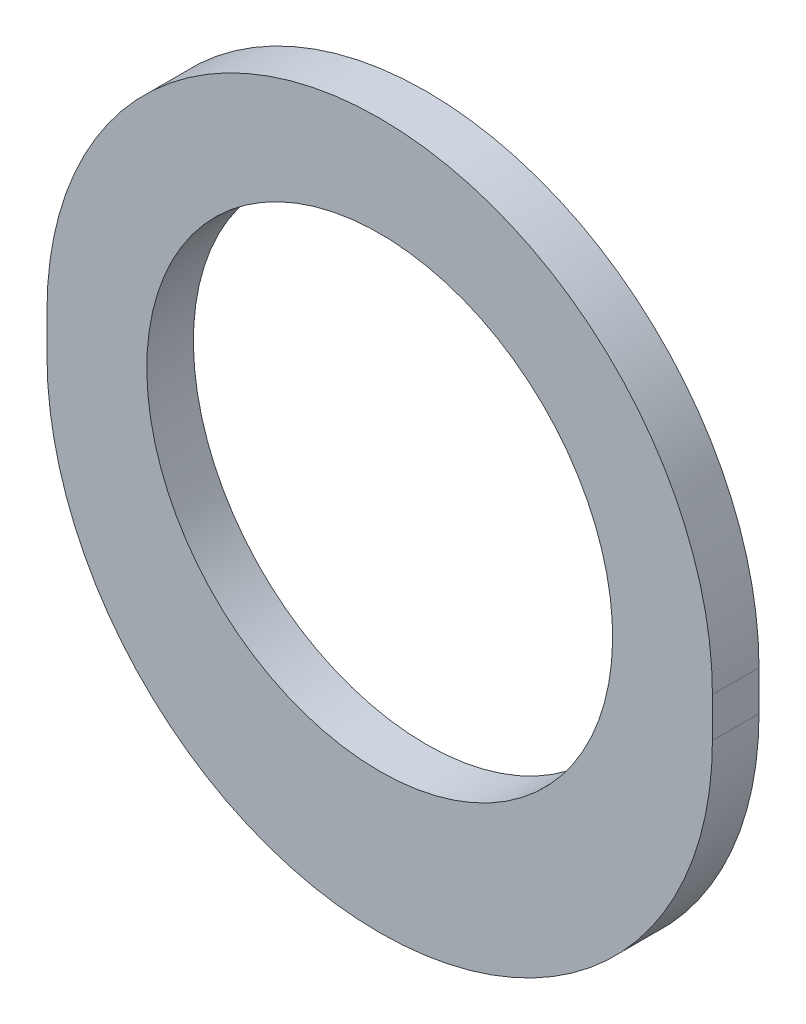
ISO-10303-21;
HEADER;
FILE_DESCRIPTION(('STEP AP214'),'2;1');
FILE_NAME('part.step','',(''),(''),'','','');
FILE_SCHEMA(('AUTOMOTIVE_DESIGN { 1 0 10303 214 1 1 1 1 }'));
ENDSEC;
DATA;
#1=APPLICATION_CONTEXT('core data for automotive mechanical design processes');
#2=APPLICATION_PROTOCOL_DEFINITION('international standard','automotive_design',2000,#1);
#3=PRODUCT_CONTEXT('',#1,'mechanical');
#4=PRODUCT('Part','Part','',(#3));
#5=PRODUCT_RELATED_PRODUCT_CATEGORY('part','',(#4));
#6=PRODUCT_DEFINITION_FORMATION('','',#4);
#7=PRODUCT_DEFINITION_CONTEXT('part definition',#1,'design');
#8=PRODUCT_DEFINITION('design','',#6,#7);
#9=PRODUCT_DEFINITION_SHAPE('','',#8);
#10=(LENGTH_UNIT() NAMED_UNIT(*) SI_UNIT(.MILLI.,.METRE.));
#11=(NAMED_UNIT(*) PLANE_ANGLE_UNIT() SI_UNIT($,.RADIAN.));
#12=(NAMED_UNIT(*) SI_UNIT($,.STERADIAN.) SOLID_ANGLE_UNIT());
#13=UNCERTAINTY_MEASURE_WITH_UNIT(LENGTH_MEASURE(1.E-05),#10,'distance_accuracy_value','');
#14=(GEOMETRIC_REPRESENTATION_CONTEXT(3) GLOBAL_UNCERTAINTY_ASSIGNED_CONTEXT((#13)) GLOBAL_UNIT_ASSIGNED_CONTEXT((#10,
#11,#12)) REPRESENTATION_CONTEXT('',''));
#15=CARTESIAN_POINT('',(0.,0.,0.));
#16=DIRECTION('',(0.,0.,1.));
#17=DIRECTION('',(1.,0.,0.));
#18=AXIS2_PLACEMENT_3D('',#15,#16,#17);
#19=CARTESIAN_POINT('',(133.95,-71.31,-0.045));
#20=DIRECTION('',(0.,0.,-1.));
#21=DIRECTION('',(0.,-1.,0.));
#22=AXIS2_PLACEMENT_3D('',#19,#20,#21);
#23=CYLINDRICAL_SURFACE('',#22,0.175);
#24=CARTESIAN_POINT('',(133.95,-71.31,-0.035));
#25=DIRECTION('',(0.,0.,-1.));
#26=DIRECTION('',(0.,-1.,0.));
#27=AXIS2_PLACEMENT_3D('',#24,#25,#26);
#28=CIRCLE('',#27,0.175);
#29=CARTESIAN_POINT('',(133.95,-71.485,-0.035));
#30=VERTEX_POINT('',#29);
#31=EDGE_CURVE('E84',#30,#30,#28,.T.);
#32=ORIENTED_EDGE('',*,*,#31,.T.);
#33=DIRECTION('',(0.,0.,1.));
#34=VECTOR('',#33,1.);
#35=CARTESIAN_POINT('',(133.95,-71.485,-0.045));
#36=LINE('',#35,#34);
#37=CARTESIAN_POINT('',(133.95,-71.485,0.));
#38=VERTEX_POINT('',#37);
#39=EDGE_CURVE('E11',#30,#38,#36,.T.);
#40=ORIENTED_EDGE('',*,*,#39,.T.);
#41=CARTESIAN_POINT('',(133.95,-71.31,0.));
#42=DIRECTION('',(0.,0.,-1.));
#43=DIRECTION('',(0.,-1.,0.));
#44=AXIS2_PLACEMENT_3D('',#41,#42,#43);
#45=CIRCLE('',#44,0.175);
#46=EDGE_CURVE('E25',#38,#38,#45,.T.);
#47=ORIENTED_EDGE('',*,*,#46,.F.);
#48=ORIENTED_EDGE('',*,*,#39,.F.);
#49=EDGE_LOOP('',(#32,#40,#47,#48));
#50=FACE_BOUND('',#49,.T.);
#51=ADVANCED_FACE('F17',(#50),#23,.F.);
#52=CARTESIAN_POINT('',(134.2,-71.34,-0.035));
#53=DIRECTION('',(-1.,0.,0.));
#54=DIRECTION('',(0.,0.,1.));
#55=AXIS2_PLACEMENT_3D('',#52,#53,#54);
#56=PLANE('',#55);
#57=DIRECTION('',(0.,1.,0.));
#58=VECTOR('',#57,1.);
#59=CARTESIAN_POINT('',(134.2,-71.34,-0.035));
#60=LINE('',#59,#58);
#61=CARTESIAN_POINT('',(134.2,-71.34,-0.035));
#62=VERTEX_POINT('',#61);
#63=CARTESIAN_POINT('',(134.2,-71.31,-0.035));
#64=VERTEX_POINT('',#63);
#65=EDGE_CURVE('E73',#62,#64,#60,.T.);
#66=ORIENTED_EDGE('',*,*,#65,.T.);
#67=DIRECTION('',(0.,0.,1.));
#68=VECTOR('',#67,1.);
#69=CARTESIAN_POINT('',(134.2,-71.31,-0.035));
#70=LINE('',#69,#68);
#71=CARTESIAN_POINT('',(134.2,-71.31,0.));
#72=VERTEX_POINT('',#71);
#73=EDGE_CURVE('E76',#64,#72,#70,.T.);
#74=ORIENTED_EDGE('',*,*,#73,.T.);
#75=DIRECTION('',(0.,1.,0.));
#76=VECTOR('',#75,1.);
#77=CARTESIAN_POINT('',(134.2,-71.34,0.));
#78=LINE('',#77,#76);
#79=CARTESIAN_POINT('',(134.2,-71.34,0.));
#80=VERTEX_POINT('',#79);
#81=EDGE_CURVE('E119',#80,#72,#78,.T.);
#82=ORIENTED_EDGE('',*,*,#81,.F.);
#83=DIRECTION('',(0.,0.,1.));
#84=VECTOR('',#83,1.);
#85=CARTESIAN_POINT('',(134.2,-71.34,-0.035));
#86=LINE('',#85,#84);
#87=EDGE_CURVE('E79',#62,#80,#86,.T.);
#88=ORIENTED_EDGE('',*,*,#87,.F.);
#89=EDGE_LOOP('',(#66,#74,#82,#88));
#90=FACE_BOUND('',#89,.T.);
#91=ADVANCED_FACE('F75',(#90),#56,.F.);
#92=CARTESIAN_POINT('',(133.7,-71.31,0.));
#93=DIRECTION('',(0.,0.,1.));
#94=DIRECTION('',(1.,0.,0.));
#95=AXIS2_PLACEMENT_3D('',#92,#93,#94);
#96=PLANE('',#95);
#97=ORIENTED_EDGE('',*,*,#46,.T.);
#98=EDGE_LOOP('',(#97));
#99=FACE_BOUND('',#98,.T.);
#100=DIRECTION('',(0.,-1.,0.));
#101=VECTOR('',#100,1.);
#102=CARTESIAN_POINT('',(133.7,-71.31,0.));
#103=LINE('',#102,#101);
#104=CARTESIAN_POINT('',(133.7,-71.31,0.));
#105=VERTEX_POINT('',#104);
#106=CARTESIAN_POINT('',(133.7,-71.34,0.));
#107=VERTEX_POINT('',#106);
#108=EDGE_CURVE('E110',#105,#107,#103,.T.);
#109=ORIENTED_EDGE('',*,*,#108,.T.);
#110=CARTESIAN_POINT('',(133.95,-71.34,0.));
#111=DIRECTION('',(0.,0.,1.));
#112=DIRECTION('',(-1.,0.,0.));
#113=AXIS2_PLACEMENT_3D('',#110,#111,#112);
#114=CIRCLE('',#113,0.25);
#115=EDGE_CURVE('E85',#107,#80,#114,.T.);
#116=ORIENTED_EDGE('',*,*,#115,.T.);
#117=ORIENTED_EDGE('',*,*,#81,.T.);
#118=CARTESIAN_POINT('',(133.95,-71.31,0.));
#119=DIRECTION('',(0.,0.,1.));
#120=DIRECTION('',(1.,0.,0.));
#121=AXIS2_PLACEMENT_3D('',#118,#119,#120);
#122=CIRCLE('',#121,0.25);
#123=EDGE_CURVE('E93',#72,#105,#122,.T.);
#124=ORIENTED_EDGE('',*,*,#123,.T.);
#125=EDGE_LOOP('',(#109,#116,#117,#124));
#126=FACE_BOUND('',#125,.T.);
#127=ADVANCED_FACE('F125',(#99,#126),#96,.T.);
#128=CARTESIAN_POINT('',(133.7,-71.31,-0.035));
#129=DIRECTION('',(0.,0.,1.));
#130=DIRECTION('',(1.,0.,0.));
#131=AXIS2_PLACEMENT_3D('',#128,#129,#130);
#132=PLANE('',#131);
#133=ORIENTED_EDGE('',*,*,#31,.F.);
#134=EDGE_LOOP('',(#133));
#135=FACE_BOUND('',#134,.T.);
#136=CARTESIAN_POINT('',(133.95,-71.31,-0.035));
#137=DIRECTION('',(0.,0.,1.));
#138=DIRECTION('',(1.,0.,0.));
#139=AXIS2_PLACEMENT_3D('',#136,#137,#138);
#140=CIRCLE('',#139,0.25);
#141=CARTESIAN_POINT('',(133.7,-71.31,-0.035));
#142=VERTEX_POINT('',#141);
#143=EDGE_CURVE('E91',#64,#142,#140,.T.);
#144=ORIENTED_EDGE('',*,*,#143,.F.);
#145=ORIENTED_EDGE('',*,*,#65,.F.);
#146=CARTESIAN_POINT('',(133.95,-71.34,-0.035));
#147=DIRECTION('',(0.,0.,1.));
#148=DIRECTION('',(-1.,0.,0.));
#149=AXIS2_PLACEMENT_3D('',#146,#147,#148);
#150=CIRCLE('',#149,0.25);
#151=CARTESIAN_POINT('',(133.7,-71.34,-0.035));
#152=VERTEX_POINT('',#151);
#153=EDGE_CURVE('E95',#152,#62,#150,.T.);
#154=ORIENTED_EDGE('',*,*,#153,.F.);
#155=DIRECTION('',(0.,-1.,0.));
#156=VECTOR('',#155,1.);
#157=CARTESIAN_POINT('',(133.7,-71.31,-0.035));
#158=LINE('',#157,#156);
#159=EDGE_CURVE('E100',#142,#152,#158,.T.);
#160=ORIENTED_EDGE('',*,*,#159,.F.);
#161=EDGE_LOOP('',(#144,#145,#154,#160));
#162=FACE_BOUND('',#161,.T.);
#163=ADVANCED_FACE('F98',(#135,#162),#132,.F.);
#164=CARTESIAN_POINT('',(133.95,-71.34,-0.035));
#165=DIRECTION('',(0.,0.,-1.));
#166=DIRECTION('',(-1.,0.,0.));
#167=AXIS2_PLACEMENT_3D('',#164,#165,#166);
#168=CYLINDRICAL_SURFACE('',#167,0.25);
#169=ORIENTED_EDGE('',*,*,#153,.T.);
#170=ORIENTED_EDGE('',*,*,#87,.T.);
#171=ORIENTED_EDGE('',*,*,#115,.F.);
#172=DIRECTION('',(0.,0.,1.));
#173=VECTOR('',#172,1.);
#174=CARTESIAN_POINT('',(133.7,-71.34,-0.035));
#175=LINE('',#174,#173);
#176=EDGE_CURVE('E158',#152,#107,#175,.T.);
#177=ORIENTED_EDGE('',*,*,#176,.F.);
#178=EDGE_LOOP('',(#169,#170,#171,#177));
#179=FACE_BOUND('',#178,.T.);
#180=ADVANCED_FACE('F142',(#179),#168,.T.);
#181=CARTESIAN_POINT('',(133.95,-71.31,-0.035));
#182=DIRECTION('',(0.,0.,-1.));
#183=DIRECTION('',(1.,0.,0.));
#184=AXIS2_PLACEMENT_3D('',#181,#182,#183);
#185=CYLINDRICAL_SURFACE('',#184,0.25);
#186=ORIENTED_EDGE('',*,*,#143,.T.);
#187=DIRECTION('',(0.,0.,1.));
#188=VECTOR('',#187,1.);
#189=CARTESIAN_POINT('',(133.7,-71.31,-0.035));
#190=LINE('',#189,#188);
#191=EDGE_CURVE('E102',#142,#105,#190,.T.);
#192=ORIENTED_EDGE('',*,*,#191,.T.);
#193=ORIENTED_EDGE('',*,*,#123,.F.);
#194=ORIENTED_EDGE('',*,*,#73,.F.);
#195=EDGE_LOOP('',(#186,#192,#193,#194));
#196=FACE_BOUND('',#195,.T.);
#197=ADVANCED_FACE('F89',(#196),#185,.T.);
#198=CARTESIAN_POINT('',(133.7,-71.31,-0.035));
#199=DIRECTION('',(1.,0.,0.));
#200=DIRECTION('',(0.,1.,0.));
#201=AXIS2_PLACEMENT_3D('',#198,#199,#200);
#202=PLANE('',#201);
#203=ORIENTED_EDGE('',*,*,#159,.T.);
#204=ORIENTED_EDGE('',*,*,#176,.T.);
#205=ORIENTED_EDGE('',*,*,#108,.F.);
#206=ORIENTED_EDGE('',*,*,#191,.F.);
#207=EDGE_LOOP('',(#203,#204,#205,#206));
#208=FACE_BOUND('',#207,.T.);
#209=ADVANCED_FACE('F149',(#208),#202,.F.);
#210=CLOSED_SHELL('',(#51,#91,#127,#163,#180,#197,#209));
#211=MANIFOLD_SOLID_BREP('B1',#210);
#212=ADVANCED_BREP_SHAPE_REPRESENTATION('',(#18,#211),#14);
#213=SHAPE_DEFINITION_REPRESENTATION(#9,#212);
ENDSEC;
END-ISO-10303-21;
